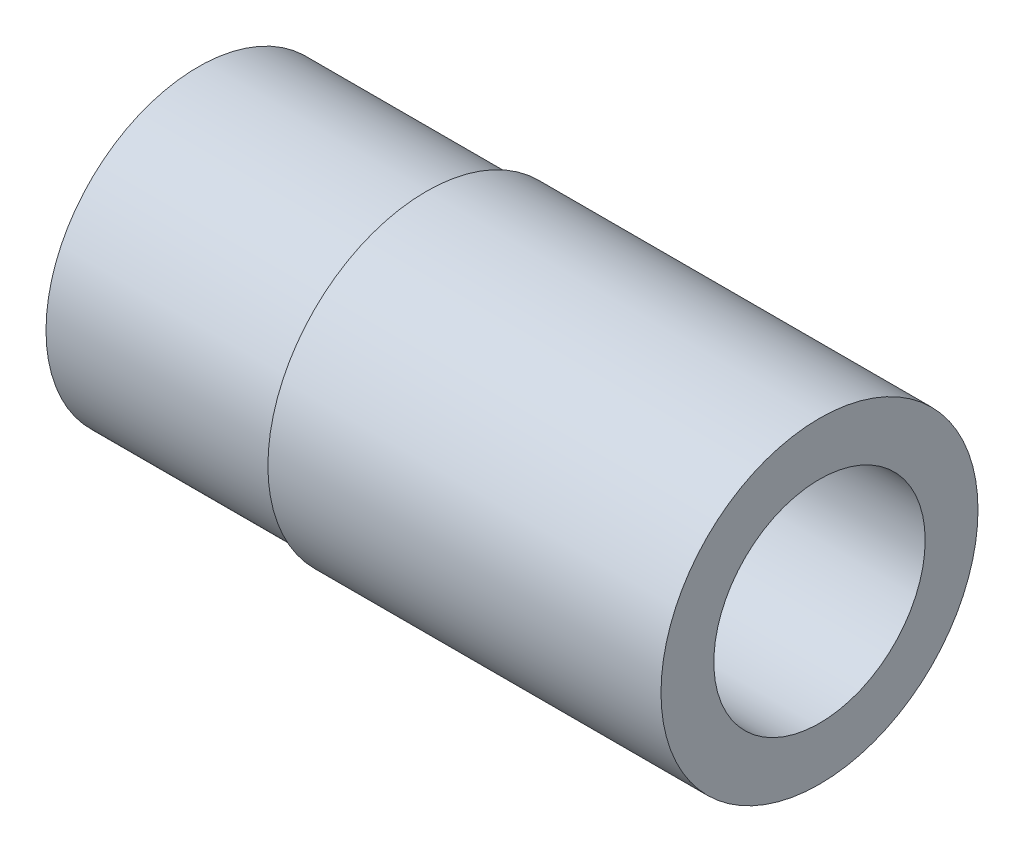
ISO-10303-21;
HEADER;
FILE_DESCRIPTION(('STEP AP214'),'2;1');
FILE_NAME('part.step','',(''),(''),'','','');
FILE_SCHEMA(('AUTOMOTIVE_DESIGN { 1 0 10303 214 1 1 1 1 }'));
ENDSEC;
DATA;
#1=APPLICATION_CONTEXT('core data for automotive mechanical design processes');
#2=APPLICATION_PROTOCOL_DEFINITION('international standard','automotive_design',2000,#1);
#3=PRODUCT_CONTEXT('',#1,'mechanical');
#4=PRODUCT('Part','Part','',(#3));
#5=PRODUCT_RELATED_PRODUCT_CATEGORY('part','',(#4));
#6=PRODUCT_DEFINITION_FORMATION('','',#4);
#7=PRODUCT_DEFINITION_CONTEXT('part definition',#1,'design');
#8=PRODUCT_DEFINITION('design','',#6,#7);
#9=PRODUCT_DEFINITION_SHAPE('','',#8);
#10=(LENGTH_UNIT() NAMED_UNIT(*) SI_UNIT(.MILLI.,.METRE.));
#11=(NAMED_UNIT(*) PLANE_ANGLE_UNIT() SI_UNIT($,.RADIAN.));
#12=(NAMED_UNIT(*) SI_UNIT($,.STERADIAN.) SOLID_ANGLE_UNIT());
#13=UNCERTAINTY_MEASURE_WITH_UNIT(LENGTH_MEASURE(1.E-05),#10,'distance_accuracy_value','');
#14=(GEOMETRIC_REPRESENTATION_CONTEXT(3) GLOBAL_UNCERTAINTY_ASSIGNED_CONTEXT((#13)) GLOBAL_UNIT_ASSIGNED_CONTEXT((#10,
#11,#12)) REPRESENTATION_CONTEXT('',''));
#15=CARTESIAN_POINT('',(0.,0.,0.));
#16=DIRECTION('',(0.,0.,1.));
#17=DIRECTION('',(1.,0.,0.));
#18=AXIS2_PLACEMENT_3D('',#15,#16,#17);
#19=CARTESIAN_POINT('',(73.5,0.,0.));
#20=DIRECTION('',(-1.,0.,0.));
#21=DIRECTION('',(0.,0.,1.));
#22=AXIS2_PLACEMENT_3D('',#19,#20,#21);
#23=CYLINDRICAL_SURFACE('',#22,37.5);
#24=CARTESIAN_POINT('',(73.5,0.,0.));
#25=DIRECTION('',(1.,0.,0.));
#26=DIRECTION('',(0.,0.,-1.));
#27=AXIS2_PLACEMENT_3D('',#24,#25,#26);
#28=CIRCLE('',#27,37.5);
#29=CARTESIAN_POINT('',(73.5,0.,-37.5));
#30=VERTEX_POINT('',#29);
#31=EDGE_CURVE('E211',#30,#30,#28,.T.);
#32=ORIENTED_EDGE('',*,*,#31,.F.);
#33=EDGE_LOOP('',(#32));
#34=FACE_BOUND('',#33,.T.);
#35=CARTESIAN_POINT('',(-19.5,0.,0.));
#36=DIRECTION('',(-1.,0.,0.));
#37=DIRECTION('',(0.,0.,1.));
#38=AXIS2_PLACEMENT_3D('',#35,#36,#37);
#39=CIRCLE('',#38,37.5);
#40=CARTESIAN_POINT('',(-19.5,0.,37.5));
#41=VERTEX_POINT('',#40);
#42=EDGE_CURVE('E264',#41,#41,#39,.T.);
#43=ORIENTED_EDGE('',*,*,#42,.F.);
#44=EDGE_LOOP('',(#43));
#45=FACE_BOUND('',#44,.T.);
#46=ADVANCED_FACE('F100',(#34,#45),#23,.T.);
#47=CARTESIAN_POINT('',(-73.5,0.,0.));
#48=DIRECTION('',(1.,0.,0.));
#49=DIRECTION('',(0.,0.,-1.));
#50=AXIS2_PLACEMENT_3D('',#47,#48,#49);
#51=PLANE('',#50);
#52=CARTESIAN_POINT('',(-73.5,0.,0.));
#53=DIRECTION('',(1.,0.,0.));
#54=DIRECTION('',(0.,0.,-1.));
#55=AXIS2_PLACEMENT_3D('',#52,#53,#54);
#56=CIRCLE('',#55,21.);
#57=CARTESIAN_POINT('',(-73.5,20.1246117974981,6.00000000000001));
#58=VERTEX_POINT('',#57);
#59=CARTESIAN_POINT('',(-73.5,20.1246117974981,-6.00000000000001));
#60=VERTEX_POINT('',#59);
#61=EDGE_CURVE('E204',#58,#60,#56,.T.);
#62=ORIENTED_EDGE('',*,*,#61,.T.);
#63=DIRECTION('',(0.,-1.,0.));
#64=VECTOR('',#63,1.);
#65=CARTESIAN_POINT('',(-73.5,3.33445395998311,-6.00000000000001));
#66=LINE('',#65,#64);
#67=CARTESIAN_POINT('',(-73.5,24.3,-6.00000000000001));
#68=VERTEX_POINT('',#67);
#69=EDGE_CURVE('E173',#68,#60,#66,.T.);
#70=ORIENTED_EDGE('',*,*,#69,.F.);
#71=DIRECTION('',(0.,0.,-1.));
#72=VECTOR('',#71,1.);
#73=CARTESIAN_POINT('',(-73.5,24.3,-6.00000000000001));
#74=LINE('',#73,#72);
#75=CARTESIAN_POINT('',(-73.5,24.3,6.00000000000001));
#76=VERTEX_POINT('',#75);
#77=EDGE_CURVE('E189',#76,#68,#74,.T.);
#78=ORIENTED_EDGE('',*,*,#77,.F.);
#79=DIRECTION('',(0.,1.,0.));
#80=VECTOR('',#79,1.);
#81=CARTESIAN_POINT('',(-73.5,3.33445395998311,6.00000000000001));
#82=LINE('',#81,#80);
#83=EDGE_CURVE('E274',#58,#76,#82,.T.);
#84=ORIENTED_EDGE('',*,*,#83,.F.);
#85=EDGE_LOOP('',(#62,#70,#78,#84));
#86=FACE_BOUND('',#85,.T.);
#87=CARTESIAN_POINT('',(-73.5,0.,0.));
#88=DIRECTION('',(-1.,0.,0.));
#89=DIRECTION('',(0.,0.,1.));
#90=AXIS2_PLACEMENT_3D('',#87,#88,#89);
#91=CIRCLE('',#90,36.);
#92=CARTESIAN_POINT('',(-73.5,0.,36.));
#93=VERTEX_POINT('',#92);
#94=EDGE_CURVE('E269',#93,#93,#91,.T.);
#95=ORIENTED_EDGE('',*,*,#94,.T.);
#96=EDGE_LOOP('',(#95));
#97=FACE_BOUND('',#96,.T.);
#98=ADVANCED_FACE('F253',(#86,#97),#51,.F.);
#99=CARTESIAN_POINT('',(37.,0.,0.));
#100=DIRECTION('',(1.,0.,0.));
#101=DIRECTION('',(0.,0.,-1.));
#102=AXIS2_PLACEMENT_3D('',#99,#100,#101);
#103=PLANE('',#102);
#104=DIRECTION('',(0.,0.,-1.));
#105=VECTOR('',#104,1.);
#106=CARTESIAN_POINT('',(37.,24.3,-6.00000000000001));
#107=LINE('',#106,#105);
#108=CARTESIAN_POINT('',(37.,24.3,5.87452125708976));
#109=VERTEX_POINT('',#108);
#110=CARTESIAN_POINT('',(37.,24.3,-5.87452125708976));
#111=VERTEX_POINT('',#110);
#112=EDGE_CURVE('E172',#109,#111,#107,.T.);
#113=ORIENTED_EDGE('',*,*,#112,.T.);
#114=CARTESIAN_POINT('',(37.,0.,0.));
#115=DIRECTION('',(1.,0.,0.));
#116=DIRECTION('',(0.,0.,-1.));
#117=AXIS2_PLACEMENT_3D('',#114,#115,#116);
#118=CIRCLE('',#117,25.);
#119=EDGE_CURVE('E205',#111,#109,#118,.T.);
#120=ORIENTED_EDGE('',*,*,#119,.T.);
#121=EDGE_LOOP('',(#113,#120));
#122=FACE_BOUND('',#121,.T.);
#123=ADVANCED_FACE('F243',(#122),#103,.T.);
#124=CARTESIAN_POINT('',(-73.5,0.,0.));
#125=DIRECTION('',(1.,0.,0.));
#126=DIRECTION('',(0.,0.,-1.));
#127=AXIS2_PLACEMENT_3D('',#124,#125,#126);
#128=CYLINDRICAL_SURFACE('',#127,21.);
#129=DIRECTION('',(1.,0.,0.));
#130=VECTOR('',#129,1.);
#131=CARTESIAN_POINT('',(-73.5,20.1246117974981,6.00000000000001));
#132=LINE('',#131,#130);
#133=CARTESIAN_POINT('',(36.5,20.1246117974981,6.00000000000001));
#134=VERTEX_POINT('',#133);
#135=EDGE_CURVE('E197',#58,#134,#132,.T.);
#136=ORIENTED_EDGE('',*,*,#135,.T.);
#137=CARTESIAN_POINT('',(36.5,0.,0.));
#138=DIRECTION('',(1.,0.,0.));
#139=DIRECTION('',(0.,0.,-1.));
#140=AXIS2_PLACEMENT_3D('',#137,#138,#139);
#141=CIRCLE('',#140,21.);
#142=CARTESIAN_POINT('',(36.5,20.1246117974981,-6.00000000000001));
#143=VERTEX_POINT('',#142);
#144=EDGE_CURVE('E114',#134,#143,#141,.T.);
#145=ORIENTED_EDGE('',*,*,#144,.T.);
#146=DIRECTION('',(1.,0.,0.));
#147=VECTOR('',#146,1.);
#148=CARTESIAN_POINT('',(-73.5,20.1246117974981,-6.00000000000001));
#149=LINE('',#148,#147);
#150=EDGE_CURVE('E200',#143,#60,#149,.F.);
#151=ORIENTED_EDGE('',*,*,#150,.T.);
#152=ORIENTED_EDGE('',*,*,#61,.F.);
#153=EDGE_LOOP('',(#136,#145,#151,#152));
#154=FACE_BOUND('',#153,.T.);
#155=ADVANCED_FACE('F247',(#154),#128,.F.);
#156=CARTESIAN_POINT('',(73.5,0.,0.));
#157=DIRECTION('',(1.,0.,0.));
#158=DIRECTION('',(0.,0.,-1.));
#159=AXIS2_PLACEMENT_3D('',#156,#157,#158);
#160=PLANE('',#159);
#161=CARTESIAN_POINT('',(73.5,0.,0.));
#162=DIRECTION('',(1.,0.,0.));
#163=DIRECTION('',(0.,0.,-1.));
#164=AXIS2_PLACEMENT_3D('',#161,#162,#163);
#165=CIRCLE('',#164,25.);
#166=CARTESIAN_POINT('',(73.5,0.,-25.));
#167=VERTEX_POINT('',#166);
#168=EDGE_CURVE('E202',#167,#167,#165,.T.);
#169=ORIENTED_EDGE('',*,*,#168,.F.);
#170=EDGE_LOOP('',(#169));
#171=FACE_BOUND('',#170,.T.);
#172=ORIENTED_EDGE('',*,*,#31,.T.);
#173=EDGE_LOOP('',(#172));
#174=FACE_BOUND('',#173,.T.);
#175=ADVANCED_FACE('F241',(#171,#174),#160,.T.);
#176=DIRECTION('',(0.,-1.,0.));
#177=VECTOR('',#176,1.);
#178=CARTESIAN_POINT('',(37.,3.33445395998311,-6.00000000000001));
#179=LINE('',#178,#177);
#180=CARTESIAN_POINT('',(37.,24.2693221990232,-6.00000000000001));
#181=VERTEX_POINT('',#180);
#182=CARTESIAN_POINT('',(37.,20.6458228220626,-6.00000000000001));
#183=VERTEX_POINT('',#182);
#184=EDGE_CURVE('E182',#181,#183,#179,.T.);
#185=ORIENTED_EDGE('',*,*,#184,.T.);
#186=CARTESIAN_POINT('',(37.,0.,0.));
#187=DIRECTION('',(1.,0.,0.));
#188=DIRECTION('',(0.,0.,-1.));
#189=AXIS2_PLACEMENT_3D('',#186,#187,#188);
#190=CIRCLE('',#189,21.5);
#191=CARTESIAN_POINT('',(37.,20.6458228220626,6.00000000000001));
#192=VERTEX_POINT('',#191);
#193=EDGE_CURVE('E214',#183,#192,#190,.F.);
#194=ORIENTED_EDGE('',*,*,#193,.T.);
#195=DIRECTION('',(0.,1.,0.));
#196=VECTOR('',#195,1.);
#197=CARTESIAN_POINT('',(37.,3.33445395998311,6.00000000000001));
#198=LINE('',#197,#196);
#199=CARTESIAN_POINT('',(37.,24.2693221990232,6.00000000000001));
#200=VERTEX_POINT('',#199);
#201=EDGE_CURVE('E198',#192,#200,#198,.T.);
#202=ORIENTED_EDGE('',*,*,#201,.T.);
#203=EDGE_CURVE('E206',#200,#181,#118,.T.);
#204=ORIENTED_EDGE('',*,*,#203,.T.);
#205=EDGE_LOOP('',(#185,#194,#202,#204));
#206=FACE_BOUND('',#205,.T.);
#207=ADVANCED_FACE('F238',(#206),#103,.T.);
#208=CARTESIAN_POINT('',(37.,0.,0.));
#209=DIRECTION('',(1.,0.,0.));
#210=DIRECTION('',(0.,0.,-1.));
#211=AXIS2_PLACEMENT_3D('',#208,#209,#210);
#212=CYLINDRICAL_SURFACE('',#211,25.);
#213=EDGE_CURVE('E168',#181,#111,#118,.T.);
#214=ORIENTED_EDGE('',*,*,#213,.F.);
#215=ORIENTED_EDGE('',*,*,#203,.F.);
#216=EDGE_CURVE('E283',#109,#200,#118,.T.);
#217=ORIENTED_EDGE('',*,*,#216,.F.);
#218=ORIENTED_EDGE('',*,*,#119,.F.);
#219=EDGE_LOOP('',(#214,#215,#217,#218));
#220=FACE_BOUND('',#219,.T.);
#221=ORIENTED_EDGE('',*,*,#168,.T.);
#222=EDGE_LOOP('',(#221));
#223=FACE_BOUND('',#222,.T.);
#224=ADVANCED_FACE('F232',(#220,#223),#212,.F.);
#225=CARTESIAN_POINT('',(61.1568648784577,3.33445395998311,-6.00000000000001));
#226=DIRECTION('',(0.,0.,-1.));
#227=DIRECTION('',(-1.,0.,0.));
#228=AXIS2_PLACEMENT_3D('',#225,#226,#227);
#229=PLANE('',#228);
#230=ORIENTED_EDGE('',*,*,#150,.F.);
#231=CARTESIAN_POINT('',(36.5,20.1246117974981,-6.00000000000001));
#232=CARTESIAN_POINT('',(36.5272897027234,20.1245830274204,-6.00000000000001));
#233=CARTESIAN_POINT('',(36.554565228085,20.1269412600804,-6.00000000000001));
#234=CARTESIAN_POINT('',(36.608278403566,20.1362108526691,-6.00000000000001));
#235=CARTESIAN_POINT('',(36.6347175919938,20.1431132740748,-6.00000000000001));
#236=CARTESIAN_POINT('',(36.6860631510349,20.1612524995307,-6.00000000000001));
#237=CARTESIAN_POINT('',(36.7109694252109,20.1724895759565,-6.00000000000001));
#238=CARTESIAN_POINT('',(36.7585902350869,20.1989118075093,-6.00000000000001));
#239=CARTESIAN_POINT('',(36.7813044213998,20.2140975905828,-6.00000000000001));
#240=CARTESIAN_POINT('',(36.8243601057125,20.2482457554234,-6.00000000000001));
#241=CARTESIAN_POINT('',(36.8446514914839,20.2672712407587,-6.00000000000001));
#242=CARTESIAN_POINT('',(36.8819019241715,20.3083453441511,-6.00000000000001));
#243=CARTESIAN_POINT('',(36.8988601317016,20.3303947213401,-6.00000000000001));
#244=CARTESIAN_POINT('',(36.9296702116463,20.3778139509721,-6.00000000000001));
#245=CARTESIAN_POINT('',(36.9433731867938,20.4032804665209,-6.00000000000001));
#246=CARTESIAN_POINT('',(36.9664815143179,20.4560935086148,-6.00000000000001));
#247=CARTESIAN_POINT('',(36.9758870309878,20.4834399632431,-6.00000000000001));
#248=CARTESIAN_POINT('',(36.9886792460365,20.5333087461925,-6.00000000000001));
#249=CARTESIAN_POINT('',(36.9929217551642,20.5556161596117,-6.00000000000001));
#250=CARTESIAN_POINT('',(36.9985823134281,20.6005548481565,-6.00000000000001));
#251=CARTESIAN_POINT('',(37.0000043037563,20.6231856268036,-6.00000000000001));
#252=CARTESIAN_POINT('',(37.,20.6458228220626,-6.00000000000001));
#253=B_SPLINE_CURVE_WITH_KNOTS('',3,(#231,#232,#233,#234,#235,#236,#237,#238,#239,#240,#241,
#242,#243,#244,#245,#246,#247,#248,#249,#250,#251,#252),.UNSPECIFIED.,.F.,.F.,(4,2,2,2,2,2,2,2,
2,2,4),(0.,0.0817457631687577,0.163331209066702,0.244921782364492,0.326525338618013,
0.409598895511764,0.492693345884998,0.579065129028988,0.665433609872675,0.733383198544973,
0.801237772229988),.UNSPECIFIED.);
#254=EDGE_CURVE('E14',#143,#183,#253,.T.);
#255=ORIENTED_EDGE('',*,*,#254,.T.);
#256=ORIENTED_EDGE('',*,*,#184,.F.);
#257=CARTESIAN_POINT('',(37.,24.3,-6.00000000000001));
#258=VERTEX_POINT('',#257);
#259=EDGE_CURVE('E165',#258,#181,#179,.T.);
#260=ORIENTED_EDGE('',*,*,#259,.F.);
#261=DIRECTION('',(-1.,0.,0.));
#262=VECTOR('',#261,1.);
#263=CARTESIAN_POINT('',(61.1568648784577,24.3,-6.00000000000001));
#264=LINE('',#263,#262);
#265=EDGE_CURVE('E179',#258,#68,#264,.T.);
#266=ORIENTED_EDGE('',*,*,#265,.T.);
#267=ORIENTED_EDGE('',*,*,#69,.T.);
#268=EDGE_LOOP('',(#230,#255,#256,#260,#266,#267));
#269=FACE_BOUND('',#268,.T.);
#270=ADVANCED_FACE('F177',(#269),#229,.F.);
#271=CARTESIAN_POINT('',(61.1568648784577,3.33445395998311,6.00000000000001));
#272=DIRECTION('',(0.,0.,1.));
#273=DIRECTION('',(1.,0.,0.));
#274=AXIS2_PLACEMENT_3D('',#271,#272,#273);
#275=PLANE('',#274);
#276=ORIENTED_EDGE('',*,*,#201,.F.);
#277=CARTESIAN_POINT('',(37.,20.6458228220626,6.00000000000001));
#278=CARTESIAN_POINT('',(37.0000194322107,20.6155849430239,6.00000000000001));
#279=CARTESIAN_POINT('',(36.9974715658354,20.5853479282362,6.00000000000001));
#280=CARTESIAN_POINT('',(36.9873820895627,20.5257056504954,6.00000000000001));
#281=CARTESIAN_POINT('',(36.9798383667128,20.4963007449648,6.00000000000001));
#282=CARTESIAN_POINT('',(36.9598897883803,20.4391554737698,6.00000000000001));
#283=CARTESIAN_POINT('',(36.9474808097869,20.4114165430064,6.00000000000001));
#284=CARTESIAN_POINT('',(36.9181001001797,20.3584820010766,6.00000000000001));
#285=CARTESIAN_POINT('',(36.901130660216,20.3332851215719,6.00000000000001));
#286=CARTESIAN_POINT('',(36.8634141082551,20.2866899712721,6.00000000000001));
#287=CARTESIAN_POINT('',(36.8427455551055,20.2652282016368,6.00000000000001));
#288=CARTESIAN_POINT('',(36.7979590075991,20.22624956407,6.00000000000001));
#289=CARTESIAN_POINT('',(36.7738407524347,20.208732994665,6.00000000000001));
#290=CARTESIAN_POINT('',(36.7238748642269,20.1789006538126,6.00000000000001));
#291=CARTESIAN_POINT('',(36.6981338117736,20.1664061106643,6.00000000000001));
#292=CARTESIAN_POINT('',(36.6448751763365,20.1461202575027,6.00000000000001));
#293=CARTESIAN_POINT('',(36.6173597981762,20.1383232303184,6.00000000000001));
#294=CARTESIAN_POINT('',(36.5746591145933,20.1302231489155,6.00000000000001));
#295=CARTESIAN_POINT('',(36.5597945505501,20.1281198938868,6.00000000000001));
#296=CARTESIAN_POINT('',(36.5299558922888,20.1253149443223,6.00000000000001));
#297=CARTESIAN_POINT('',(36.5149819915276,20.1246111910621,6.00000000000001));
#298=CARTESIAN_POINT('',(36.5,20.1246117974979,6.00000000000001));
#299=B_SPLINE_CURVE_WITH_KNOTS('',3,(#277,#278,#279,#280,#281,#282,#283,#284,#285,#286,#287,
#288,#289,#290,#291,#292,#293,#294,#295,#296,#297,#298),.UNSPECIFIED.,.F.,.F.,(4,2,2,2,2,2,2,2,
2,2,4),(0.,0.0906066828781438,0.181251711532509,0.27197372486595,0.362650246882528,
0.451590449635816,0.540537380086854,0.625955271697894,0.711268993271209,0.756248777353773,
0.801162345241793),.UNSPECIFIED.);
#300=EDGE_CURVE('E128',#192,#134,#299,.T.);
#301=ORIENTED_EDGE('',*,*,#300,.T.);
#302=ORIENTED_EDGE('',*,*,#135,.F.);
#303=ORIENTED_EDGE('',*,*,#83,.T.);
#304=DIRECTION('',(-1.,0.,0.));
#305=VECTOR('',#304,1.);
#306=CARTESIAN_POINT('',(61.1568648784577,24.3,6.00000000000001));
#307=LINE('',#306,#305);
#308=CARTESIAN_POINT('',(37.,24.3,6.00000000000001));
#309=VERTEX_POINT('',#308);
#310=EDGE_CURVE('E195',#309,#76,#307,.T.);
#311=ORIENTED_EDGE('',*,*,#310,.F.);
#312=EDGE_CURVE('E184',#200,#309,#198,.T.);
#313=ORIENTED_EDGE('',*,*,#312,.F.);
#314=EDGE_LOOP('',(#276,#301,#302,#303,#311,#313));
#315=FACE_BOUND('',#314,.T.);
#316=ADVANCED_FACE('F222',(#315),#275,.F.);
#317=CARTESIAN_POINT('',(37.,0.,0.));
#318=DIRECTION('',(1.,0.,0.));
#319=DIRECTION('',(0.,0.,-1.));
#320=AXIS2_PLACEMENT_3D('',#317,#318,#319);
#321=PLANE('',#320);
#322=ORIENTED_EDGE('',*,*,#312,.T.);
#323=EDGE_CURVE('E175',#309,#109,#107,.T.);
#324=ORIENTED_EDGE('',*,*,#323,.T.);
#325=ORIENTED_EDGE('',*,*,#216,.T.);
#326=EDGE_LOOP('',(#322,#324,#325));
#327=FACE_BOUND('',#326,.T.);
#328=ADVANCED_FACE('F226',(#327),#321,.F.);
#329=EDGE_CURVE('E162',#111,#258,#107,.T.);
#330=ORIENTED_EDGE('',*,*,#329,.T.);
#331=ORIENTED_EDGE('',*,*,#259,.T.);
#332=ORIENTED_EDGE('',*,*,#213,.T.);
#333=EDGE_LOOP('',(#330,#331,#332));
#334=FACE_BOUND('',#333,.T.);
#335=ADVANCED_FACE('F164',(#334),#321,.F.);
#336=CARTESIAN_POINT('',(61.1568648784577,24.3,-6.00000000000001));
#337=DIRECTION('',(0.,1.,0.));
#338=DIRECTION('',(0.,0.,1.));
#339=AXIS2_PLACEMENT_3D('',#336,#337,#338);
#340=PLANE('',#339);
#341=ORIENTED_EDGE('',*,*,#310,.T.);
#342=ORIENTED_EDGE('',*,*,#77,.T.);
#343=ORIENTED_EDGE('',*,*,#265,.F.);
#344=ORIENTED_EDGE('',*,*,#329,.F.);
#345=ORIENTED_EDGE('',*,*,#112,.F.);
#346=ORIENTED_EDGE('',*,*,#323,.F.);
#347=EDGE_LOOP('',(#341,#342,#343,#344,#345,#346));
#348=FACE_BOUND('',#347,.T.);
#349=ADVANCED_FACE('F187',(#348),#340,.F.);
#350=CARTESIAN_POINT('',(36.5,0.,0.));
#351=DIRECTION('',(1.,0.,0.));
#352=DIRECTION('',(0.,0.,-1.));
#353=AXIS2_PLACEMENT_3D('',#350,#351,#352);
#354=TOROIDAL_SURFACE('',#353,21.5,0.5);
#355=ORIENTED_EDGE('',*,*,#254,.F.);
#356=ORIENTED_EDGE('',*,*,#144,.F.);
#357=ORIENTED_EDGE('',*,*,#300,.F.);
#358=ORIENTED_EDGE('',*,*,#193,.F.);
#359=EDGE_LOOP('',(#355,#356,#357,#358));
#360=FACE_BOUND('',#359,.T.);
#361=ADVANCED_FACE('F102',(#360),#354,.T.);
#362=CARTESIAN_POINT('',(-73.5,0.,0.));
#363=DIRECTION('',(-1.,0.,0.));
#364=DIRECTION('',(0.,0.,1.));
#365=AXIS2_PLACEMENT_3D('',#362,#363,#364);
#366=CYLINDRICAL_SURFACE('',#365,36.);
#367=CARTESIAN_POINT('',(-19.5,0.,0.));
#368=DIRECTION('',(-1.,0.,0.));
#369=DIRECTION('',(0.,0.,1.));
#370=AXIS2_PLACEMENT_3D('',#367,#368,#369);
#371=CIRCLE('',#370,36.);
#372=CARTESIAN_POINT('',(-19.5,0.,36.));
#373=VERTEX_POINT('',#372);
#374=EDGE_CURVE('E266',#373,#373,#371,.T.);
#375=ORIENTED_EDGE('',*,*,#374,.T.);
#376=EDGE_LOOP('',(#375));
#377=FACE_BOUND('',#376,.T.);
#378=ORIENTED_EDGE('',*,*,#94,.F.);
#379=EDGE_LOOP('',(#378));
#380=FACE_BOUND('',#379,.T.);
#381=ADVANCED_FACE('F227',(#377,#380),#366,.T.);
#382=CARTESIAN_POINT('',(-19.5,37.5,0.));
#383=DIRECTION('',(-1.,0.,0.));
#384=DIRECTION('',(0.,0.,1.));
#385=AXIS2_PLACEMENT_3D('',#382,#383,#384);
#386=PLANE('',#385);
#387=ORIENTED_EDGE('',*,*,#42,.T.);
#388=EDGE_LOOP('',(#387));
#389=FACE_BOUND('',#388,.T.);
#390=ORIENTED_EDGE('',*,*,#374,.F.);
#391=EDGE_LOOP('',(#390));
#392=FACE_BOUND('',#391,.T.);
#393=ADVANCED_FACE('F298',(#389,#392),#386,.T.);
#394=CLOSED_SHELL('',(#46,#98,#123,#155,#175,#207,#224,#270,#316,#328,#335,#349,#361,#381,#393));
#395=MANIFOLD_SOLID_BREP('B2',#394);
#396=ADVANCED_BREP_SHAPE_REPRESENTATION('',(#18,#395),#14);
#397=SHAPE_DEFINITION_REPRESENTATION(#9,#396);
ENDSEC;
END-ISO-10303-21;
